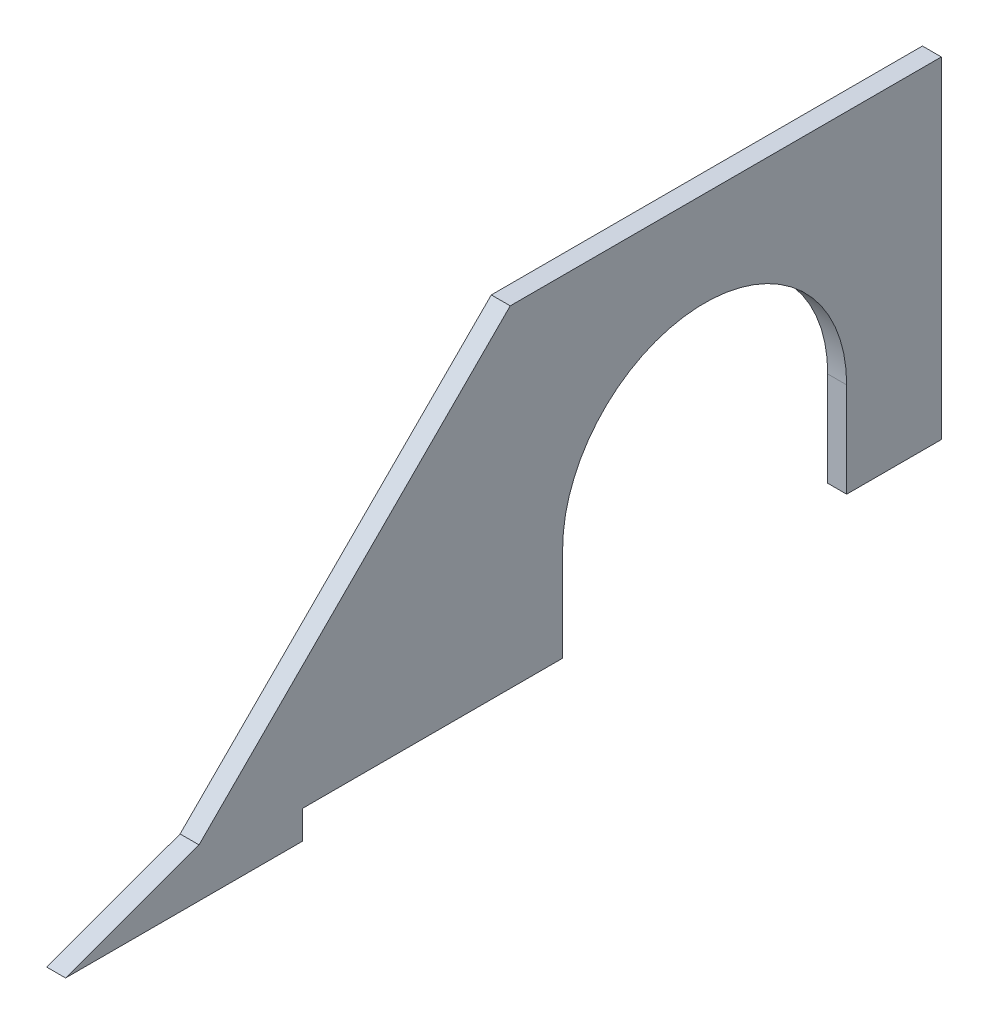
ISO-10303-21;
HEADER;
FILE_DESCRIPTION(('STEP AP214'),'2;1');
FILE_NAME('part.step','',(''),(''),'','','');
FILE_SCHEMA(('AUTOMOTIVE_DESIGN { 1 0 10303 214 1 1 1 1 }'));
ENDSEC;
DATA;
#1=APPLICATION_CONTEXT('core data for automotive mechanical design processes');
#2=APPLICATION_PROTOCOL_DEFINITION('international standard','automotive_design',2000,#1);
#3=PRODUCT_CONTEXT('',#1,'mechanical');
#4=PRODUCT('Part','Part','',(#3));
#5=PRODUCT_RELATED_PRODUCT_CATEGORY('part','',(#4));
#6=PRODUCT_DEFINITION_FORMATION('','',#4);
#7=PRODUCT_DEFINITION_CONTEXT('part definition',#1,'design');
#8=PRODUCT_DEFINITION('design','',#6,#7);
#9=PRODUCT_DEFINITION_SHAPE('','',#8);
#10=(LENGTH_UNIT() NAMED_UNIT(*) SI_UNIT(.MILLI.,.METRE.));
#11=(NAMED_UNIT(*) PLANE_ANGLE_UNIT() SI_UNIT($,.RADIAN.));
#12=(NAMED_UNIT(*) SI_UNIT($,.STERADIAN.) SOLID_ANGLE_UNIT());
#13=UNCERTAINTY_MEASURE_WITH_UNIT(LENGTH_MEASURE(1.E-05),#10,'distance_accuracy_value','');
#14=(GEOMETRIC_REPRESENTATION_CONTEXT(3) GLOBAL_UNCERTAINTY_ASSIGNED_CONTEXT((#13)) GLOBAL_UNIT_ASSIGNED_CONTEXT((#10,
#11,#12)) REPRESENTATION_CONTEXT('',''));
#15=CARTESIAN_POINT('',(0.,0.,0.));
#16=DIRECTION('',(0.,0.,1.));
#17=DIRECTION('',(1.,0.,0.));
#18=AXIS2_PLACEMENT_3D('',#15,#16,#17);
#19=CARTESIAN_POINT('',(4.,6.,-50.));
#20=DIRECTION('',(0.,1.,0.));
#21=DIRECTION('',(0.,0.,1.));
#22=AXIS2_PLACEMENT_3D('',#19,#20,#21);
#23=PLANE('',#22);
#24=DIRECTION('',(0.,0.,-1.));
#25=VECTOR('',#24,1.);
#26=CARTESIAN_POINT('',(0.,6.,-50.));
#27=LINE('',#26,#25);
#28=CARTESIAN_POINT('',(0.,6.,-50.));
#29=VERTEX_POINT('',#28);
#30=CARTESIAN_POINT('',(0.,6.,-105.));
#31=VERTEX_POINT('',#30);
#32=EDGE_CURVE('E148',#29,#31,#27,.T.);
#33=ORIENTED_EDGE('',*,*,#32,.T.);
#34=DIRECTION('',(1.,0.,0.));
#35=VECTOR('',#34,1.);
#36=CARTESIAN_POINT('',(0.,6.,-105.));
#37=LINE('',#36,#35);
#38=CARTESIAN_POINT('',(4.,6.,-105.));
#39=VERTEX_POINT('',#38);
#40=EDGE_CURVE('E191',#31,#39,#37,.T.);
#41=ORIENTED_EDGE('',*,*,#40,.T.);
#42=DIRECTION('',(0.,0.,-1.));
#43=VECTOR('',#42,1.);
#44=CARTESIAN_POINT('',(4.,6.,-50.));
#45=LINE('',#44,#43);
#46=CARTESIAN_POINT('',(4.,6.,-50.));
#47=VERTEX_POINT('',#46);
#48=EDGE_CURVE('E169',#47,#39,#45,.T.);
#49=ORIENTED_EDGE('',*,*,#48,.F.);
#50=DIRECTION('',(-1.,0.,0.));
#51=VECTOR('',#50,1.);
#52=CARTESIAN_POINT('',(4.,6.,-50.));
#53=LINE('',#52,#51);
#54=EDGE_CURVE('E45',#47,#29,#53,.T.);
#55=ORIENTED_EDGE('',*,*,#54,.T.);
#56=EDGE_LOOP('',(#33,#41,#49,#55));
#57=FACE_BOUND('',#56,.T.);
#58=ADVANCED_FACE('F37',(#57),#23,.F.);
#59=CARTESIAN_POINT('',(4.,0.,-50.));
#60=DIRECTION('',(0.,1.,0.));
#61=DIRECTION('',(0.,0.,1.));
#62=AXIS2_PLACEMENT_3D('',#59,#60,#61);
#63=PLANE('',#62);
#64=DIRECTION('',(0.,0.,-1.));
#65=VECTOR('',#64,1.);
#66=CARTESIAN_POINT('',(0.,0.,-50.));
#67=LINE('',#66,#65);
#68=CARTESIAN_POINT('',(0.,0.,0.));
#69=VERTEX_POINT('',#68);
#70=CARTESIAN_POINT('',(0.,0.,-50.));
#71=VERTEX_POINT('',#70);
#72=EDGE_CURVE('E141',#69,#71,#67,.T.);
#73=ORIENTED_EDGE('',*,*,#72,.T.);
#74=DIRECTION('',(-1.,0.,0.));
#75=VECTOR('',#74,1.);
#76=CARTESIAN_POINT('',(4.,0.,-50.));
#77=LINE('',#76,#75);
#78=CARTESIAN_POINT('',(4.,0.,-50.));
#79=VERTEX_POINT('',#78);
#80=EDGE_CURVE('E11',#79,#71,#77,.T.);
#81=ORIENTED_EDGE('',*,*,#80,.F.);
#82=DIRECTION('',(0.,0.,-1.));
#83=VECTOR('',#82,1.);
#84=CARTESIAN_POINT('',(4.,0.,-50.));
#85=LINE('',#84,#83);
#86=CARTESIAN_POINT('',(4.,0.,0.));
#87=VERTEX_POINT('',#86);
#88=EDGE_CURVE('E157',#87,#79,#85,.T.);
#89=ORIENTED_EDGE('',*,*,#88,.F.);
#90=DIRECTION('',(-1.,0.,0.));
#91=VECTOR('',#90,1.);
#92=CARTESIAN_POINT('',(4.,0.,0.));
#93=LINE('',#92,#91);
#94=EDGE_CURVE('E137',#87,#69,#93,.T.);
#95=ORIENTED_EDGE('',*,*,#94,.T.);
#96=EDGE_LOOP('',(#73,#81,#89,#95));
#97=FACE_BOUND('',#96,.T.);
#98=ADVANCED_FACE('F39',(#97),#63,.F.);
#99=CARTESIAN_POINT('',(4.,0.,-50.));
#100=DIRECTION('',(0.,0.,1.));
#101=DIRECTION('',(1.,0.,0.));
#102=AXIS2_PLACEMENT_3D('',#99,#100,#101);
#103=PLANE('',#102);
#104=DIRECTION('',(0.,1.,0.));
#105=VECTOR('',#104,1.);
#106=CARTESIAN_POINT('',(0.,0.,-50.));
#107=LINE('',#106,#105);
#108=EDGE_CURVE('E144',#71,#29,#107,.T.);
#109=ORIENTED_EDGE('',*,*,#108,.T.);
#110=ORIENTED_EDGE('',*,*,#54,.F.);
#111=DIRECTION('',(0.,1.,0.));
#112=VECTOR('',#111,1.);
#113=CARTESIAN_POINT('',(4.,0.,-50.));
#114=LINE('',#113,#112);
#115=EDGE_CURVE('E99',#79,#47,#114,.T.);
#116=ORIENTED_EDGE('',*,*,#115,.F.);
#117=ORIENTED_EDGE('',*,*,#80,.T.);
#118=EDGE_LOOP('',(#109,#110,#116,#117));
#119=FACE_BOUND('',#118,.T.);
#120=ADVANCED_FACE('F225',(#119),#103,.F.);
#121=CARTESIAN_POINT('',(4.,6.,-165.));
#122=VERTEX_POINT('',#121);
#123=CARTESIAN_POINT('',(4.,6.,-185.));
#124=VERTEX_POINT('',#123);
#125=EDGE_CURVE('E206',#122,#124,#45,.T.);
#126=ORIENTED_EDGE('',*,*,#125,.F.);
#127=DIRECTION('',(1.,0.,0.));
#128=VECTOR('',#127,1.);
#129=CARTESIAN_POINT('',(0.,6.,-165.));
#130=LINE('',#129,#128);
#131=CARTESIAN_POINT('',(0.,6.,-165.));
#132=VERTEX_POINT('',#131);
#133=EDGE_CURVE('E200',#132,#122,#130,.T.);
#134=ORIENTED_EDGE('',*,*,#133,.F.);
#135=CARTESIAN_POINT('',(0.,6.,-185.));
#136=VERTEX_POINT('',#135);
#137=EDGE_CURVE('E147',#132,#136,#27,.T.);
#138=ORIENTED_EDGE('',*,*,#137,.T.);
#139=DIRECTION('',(-1.,0.,0.));
#140=VECTOR('',#139,1.);
#141=CARTESIAN_POINT('',(4.,6.,-185.));
#142=LINE('',#141,#140);
#143=EDGE_CURVE('E161',#124,#136,#142,.T.);
#144=ORIENTED_EDGE('',*,*,#143,.F.);
#145=EDGE_LOOP('',(#126,#134,#138,#144));
#146=FACE_BOUND('',#145,.T.);
#147=ADVANCED_FACE('F216',(#146),#23,.F.);
#148=CARTESIAN_POINT('',(4.,6.,-185.));
#149=DIRECTION('',(0.,0.,1.));
#150=DIRECTION('',(1.,0.,0.));
#151=AXIS2_PLACEMENT_3D('',#148,#149,#150);
#152=PLANE('',#151);
#153=DIRECTION('',(0.,1.,0.));
#154=VECTOR('',#153,1.);
#155=CARTESIAN_POINT('',(0.,6.,-185.));
#156=LINE('',#155,#154);
#157=CARTESIAN_POINT('',(0.,76.,-185.));
#158=VERTEX_POINT('',#157);
#159=EDGE_CURVE('E151',#136,#158,#156,.T.);
#160=ORIENTED_EDGE('',*,*,#159,.T.);
#161=DIRECTION('',(-1.,0.,0.));
#162=VECTOR('',#161,1.);
#163=CARTESIAN_POINT('',(4.,76.,-185.));
#164=LINE('',#163,#162);
#165=CARTESIAN_POINT('',(4.,76.,-185.));
#166=VERTEX_POINT('',#165);
#167=EDGE_CURVE('E132',#166,#158,#164,.T.);
#168=ORIENTED_EDGE('',*,*,#167,.F.);
#169=DIRECTION('',(0.,1.,0.));
#170=VECTOR('',#169,1.);
#171=CARTESIAN_POINT('',(4.,6.,-185.));
#172=LINE('',#171,#170);
#173=EDGE_CURVE('E120',#124,#166,#172,.T.);
#174=ORIENTED_EDGE('',*,*,#173,.F.);
#175=ORIENTED_EDGE('',*,*,#143,.T.);
#176=EDGE_LOOP('',(#160,#168,#174,#175));
#177=FACE_BOUND('',#176,.T.);
#178=ADVANCED_FACE('F220',(#177),#152,.F.);
#179=CARTESIAN_POINT('',(4.,76.,-185.));
#180=DIRECTION('',(0.,-1.,0.));
#181=DIRECTION('',(0.,0.,-1.));
#182=AXIS2_PLACEMENT_3D('',#179,#180,#181);
#183=PLANE('',#182);
#184=DIRECTION('',(0.,0.,1.));
#185=VECTOR('',#184,1.);
#186=CARTESIAN_POINT('',(0.,76.,-185.));
#187=LINE('',#186,#185);
#188=CARTESIAN_POINT('',(0.,76.,-93.9301743238081));
#189=VERTEX_POINT('',#188);
#190=EDGE_CURVE('E129',#158,#189,#187,.T.);
#191=ORIENTED_EDGE('',*,*,#190,.T.);
#192=DIRECTION('',(-1.,0.,0.));
#193=VECTOR('',#192,1.);
#194=CARTESIAN_POINT('',(4.,76.,-93.9301743238081));
#195=LINE('',#194,#193);
#196=CARTESIAN_POINT('',(4.,76.,-93.9301743238081));
#197=VERTEX_POINT('',#196);
#198=EDGE_CURVE('E126',#197,#189,#195,.T.);
#199=ORIENTED_EDGE('',*,*,#198,.F.);
#200=DIRECTION('',(0.,0.,1.));
#201=VECTOR('',#200,1.);
#202=CARTESIAN_POINT('',(4.,76.,-185.));
#203=LINE('',#202,#201);
#204=EDGE_CURVE('E112',#166,#197,#203,.T.);
#205=ORIENTED_EDGE('',*,*,#204,.F.);
#206=ORIENTED_EDGE('',*,*,#167,.T.);
#207=EDGE_LOOP('',(#191,#199,#205,#206));
#208=FACE_BOUND('',#207,.T.);
#209=ADVANCED_FACE('F127',(#208),#183,.F.);
#210=CARTESIAN_POINT('',(4.,76.,-93.9301743238081));
#211=DIRECTION('',(0.,-0.707106781186551,-0.707106781186544));
#212=DIRECTION('',(0.,0.707106781186544,-0.707106781186551));
#213=AXIS2_PLACEMENT_3D('',#210,#211,#212);
#214=PLANE('',#213);
#215=DIRECTION('',(0.,-0.707106781186544,0.707106781186551));
#216=VECTOR('',#215,1.);
#217=CARTESIAN_POINT('',(0.,76.,-93.9301743238081));
#218=LINE('',#217,#216);
#219=CARTESIAN_POINT('',(0.,10.2606042997699,-28.1907786235773));
#220=VERTEX_POINT('',#219);
#221=EDGE_CURVE('E154',#189,#220,#218,.T.);
#222=ORIENTED_EDGE('',*,*,#221,.T.);
#223=DIRECTION('',(-1.,0.,0.));
#224=VECTOR('',#223,1.);
#225=CARTESIAN_POINT('',(4.,10.2606042997699,-28.1907786235773));
#226=LINE('',#225,#224);
#227=CARTESIAN_POINT('',(4.,10.2606042997699,-28.1907786235773));
#228=VERTEX_POINT('',#227);
#229=EDGE_CURVE('E133',#228,#220,#226,.T.);
#230=ORIENTED_EDGE('',*,*,#229,.F.);
#231=DIRECTION('',(0.,-0.707106781186544,0.707106781186551));
#232=VECTOR('',#231,1.);
#233=CARTESIAN_POINT('',(4.,76.,-93.9301743238081));
#234=LINE('',#233,#232);
#235=EDGE_CURVE('E117',#197,#228,#234,.T.);
#236=ORIENTED_EDGE('',*,*,#235,.F.);
#237=ORIENTED_EDGE('',*,*,#198,.T.);
#238=EDGE_LOOP('',(#222,#230,#236,#237));
#239=FACE_BOUND('',#238,.T.);
#240=ADVANCED_FACE('F135',(#239),#214,.F.);
#241=CARTESIAN_POINT('',(4.,0.,0.));
#242=DIRECTION('',(0.,-0.93969262078591,-0.342020143325663));
#243=DIRECTION('',(0.,0.342020143325663,-0.93969262078591));
#244=AXIS2_PLACEMENT_3D('',#241,#242,#243);
#245=PLANE('',#244);
#246=DIRECTION('',(0.,-0.342020143325663,0.93969262078591));
#247=VECTOR('',#246,1.);
#248=CARTESIAN_POINT('',(0.,0.,0.));
#249=LINE('',#248,#247);
#250=EDGE_CURVE('E91',#220,#69,#249,.T.);
#251=ORIENTED_EDGE('',*,*,#250,.T.);
#252=ORIENTED_EDGE('',*,*,#94,.F.);
#253=DIRECTION('',(0.,-0.342020143325663,0.93969262078591));
#254=VECTOR('',#253,1.);
#255=CARTESIAN_POINT('',(4.,0.,0.));
#256=LINE('',#255,#254);
#257=EDGE_CURVE('E61',#228,#87,#256,.T.);
#258=ORIENTED_EDGE('',*,*,#257,.F.);
#259=ORIENTED_EDGE('',*,*,#229,.T.);
#260=EDGE_LOOP('',(#251,#252,#258,#259));
#261=FACE_BOUND('',#260,.T.);
#262=ADVANCED_FACE('F221',(#261),#245,.F.);
#263=CARTESIAN_POINT('',(4.,0.,0.));
#264=DIRECTION('',(-1.,0.,0.));
#265=DIRECTION('',(0.,0.,1.));
#266=AXIS2_PLACEMENT_3D('',#263,#264,#265);
#267=PLANE('',#266);
#268=ORIENTED_EDGE('',*,*,#48,.T.);
#269=DIRECTION('',(0.,-1.,0.));
#270=VECTOR('',#269,1.);
#271=CARTESIAN_POINT('',(4.,6.,-105.));
#272=LINE('',#271,#270);
#273=CARTESIAN_POINT('',(4.,26.,-105.));
#274=VERTEX_POINT('',#273);
#275=EDGE_CURVE('E192',#274,#39,#272,.T.);
#276=ORIENTED_EDGE('',*,*,#275,.F.);
#277=CARTESIAN_POINT('',(4.,26.,-135.));
#278=DIRECTION('',(1.,0.,0.));
#279=DIRECTION('',(0.,0.,-1.));
#280=AXIS2_PLACEMENT_3D('',#277,#278,#279);
#281=CIRCLE('',#280,30.);
#282=CARTESIAN_POINT('',(4.,26.,-165.));
#283=VERTEX_POINT('',#282);
#284=EDGE_CURVE('E183',#283,#274,#281,.T.);
#285=ORIENTED_EDGE('',*,*,#284,.F.);
#286=DIRECTION('',(0.,1.,0.));
#287=VECTOR('',#286,1.);
#288=CARTESIAN_POINT('',(4.,6.,-165.));
#289=LINE('',#288,#287);
#290=EDGE_CURVE('E187',#122,#283,#289,.T.);
#291=ORIENTED_EDGE('',*,*,#290,.F.);
#292=ORIENTED_EDGE('',*,*,#125,.T.);
#293=ORIENTED_EDGE('',*,*,#173,.T.);
#294=ORIENTED_EDGE('',*,*,#204,.T.);
#295=ORIENTED_EDGE('',*,*,#235,.T.);
#296=ORIENTED_EDGE('',*,*,#257,.T.);
#297=ORIENTED_EDGE('',*,*,#88,.T.);
#298=ORIENTED_EDGE('',*,*,#115,.T.);
#299=EDGE_LOOP('',(#268,#276,#285,#291,#292,#293,#294,#295,#296,#297,#298));
#300=FACE_BOUND('',#299,.T.);
#301=ADVANCED_FACE('F115',(#300),#267,.F.);
#302=CARTESIAN_POINT('',(0.,0.,0.));
#303=DIRECTION('',(-1.,0.,0.));
#304=DIRECTION('',(0.,0.,1.));
#305=AXIS2_PLACEMENT_3D('',#302,#303,#304);
#306=PLANE('',#305);
#307=DIRECTION('',(0.,-1.,0.));
#308=VECTOR('',#307,1.);
#309=CARTESIAN_POINT('',(0.,6.,-105.));
#310=LINE('',#309,#308);
#311=CARTESIAN_POINT('',(0.,26.,-105.));
#312=VERTEX_POINT('',#311);
#313=EDGE_CURVE('E175',#312,#31,#310,.T.);
#314=ORIENTED_EDGE('',*,*,#313,.T.);
#315=ORIENTED_EDGE('',*,*,#32,.F.);
#316=ORIENTED_EDGE('',*,*,#108,.F.);
#317=ORIENTED_EDGE('',*,*,#72,.F.);
#318=ORIENTED_EDGE('',*,*,#250,.F.);
#319=ORIENTED_EDGE('',*,*,#221,.F.);
#320=ORIENTED_EDGE('',*,*,#190,.F.);
#321=ORIENTED_EDGE('',*,*,#159,.F.);
#322=ORIENTED_EDGE('',*,*,#137,.F.);
#323=DIRECTION('',(0.,1.,0.));
#324=VECTOR('',#323,1.);
#325=CARTESIAN_POINT('',(0.,6.,-165.));
#326=LINE('',#325,#324);
#327=CARTESIAN_POINT('',(0.,26.,-165.));
#328=VERTEX_POINT('',#327);
#329=EDGE_CURVE('E182',#132,#328,#326,.T.);
#330=ORIENTED_EDGE('',*,*,#329,.T.);
#331=CARTESIAN_POINT('',(0.,26.,-135.));
#332=DIRECTION('',(1.,0.,0.));
#333=DIRECTION('',(0.,0.,-1.));
#334=AXIS2_PLACEMENT_3D('',#331,#332,#333);
#335=CIRCLE('',#334,30.);
#336=EDGE_CURVE('E52',#328,#312,#335,.T.);
#337=ORIENTED_EDGE('',*,*,#336,.T.);
#338=EDGE_LOOP('',(#314,#315,#316,#317,#318,#319,#320,#321,#322,#330,#337));
#339=FACE_BOUND('',#338,.T.);
#340=ADVANCED_FACE('F172',(#339),#306,.T.);
#341=CARTESIAN_POINT('',(0.,6.,-105.));
#342=DIRECTION('',(0.,0.,1.));
#343=DIRECTION('',(1.,0.,0.));
#344=AXIS2_PLACEMENT_3D('',#341,#342,#343);
#345=PLANE('',#344);
#346=ORIENTED_EDGE('',*,*,#275,.T.);
#347=ORIENTED_EDGE('',*,*,#40,.F.);
#348=ORIENTED_EDGE('',*,*,#313,.F.);
#349=DIRECTION('',(1.,0.,0.));
#350=VECTOR('',#349,1.);
#351=CARTESIAN_POINT('',(0.,26.,-105.));
#352=LINE('',#351,#350);
#353=EDGE_CURVE('E145',#312,#274,#352,.T.);
#354=ORIENTED_EDGE('',*,*,#353,.T.);
#355=EDGE_LOOP('',(#346,#347,#348,#354));
#356=FACE_BOUND('',#355,.T.);
#357=ADVANCED_FACE('F246',(#356),#345,.F.);
#358=CARTESIAN_POINT('',(0.,26.,-135.));
#359=DIRECTION('',(1.,0.,0.));
#360=DIRECTION('',(0.,0.,-1.));
#361=AXIS2_PLACEMENT_3D('',#358,#359,#360);
#362=CYLINDRICAL_SURFACE('',#361,30.);
#363=ORIENTED_EDGE('',*,*,#284,.T.);
#364=ORIENTED_EDGE('',*,*,#353,.F.);
#365=ORIENTED_EDGE('',*,*,#336,.F.);
#366=DIRECTION('',(1.,0.,0.));
#367=VECTOR('',#366,1.);
#368=CARTESIAN_POINT('',(0.,26.,-165.));
#369=LINE('',#368,#367);
#370=EDGE_CURVE('E198',#328,#283,#369,.T.);
#371=ORIENTED_EDGE('',*,*,#370,.T.);
#372=EDGE_LOOP('',(#363,#364,#365,#371));
#373=FACE_BOUND('',#372,.T.);
#374=ADVANCED_FACE('F251',(#373),#362,.F.);
#375=CARTESIAN_POINT('',(0.,6.,-165.));
#376=DIRECTION('',(0.,0.,-1.));
#377=DIRECTION('',(-1.,0.,0.));
#378=AXIS2_PLACEMENT_3D('',#375,#376,#377);
#379=PLANE('',#378);
#380=ORIENTED_EDGE('',*,*,#290,.T.);
#381=ORIENTED_EDGE('',*,*,#370,.F.);
#382=ORIENTED_EDGE('',*,*,#329,.F.);
#383=ORIENTED_EDGE('',*,*,#133,.T.);
#384=EDGE_LOOP('',(#380,#381,#382,#383));
#385=FACE_BOUND('',#384,.T.);
#386=ADVANCED_FACE('F252',(#385),#379,.F.);
#387=CLOSED_SHELL('',(#58,#98,#120,#147,#178,#209,#240,#262,#301,#340,#357,#374,#386));
#388=MANIFOLD_SOLID_BREP('B2',#387);
#389=ADVANCED_BREP_SHAPE_REPRESENTATION('',(#18,#388),#14);
#390=SHAPE_DEFINITION_REPRESENTATION(#9,#389);
ENDSEC;
END-ISO-10303-21;
